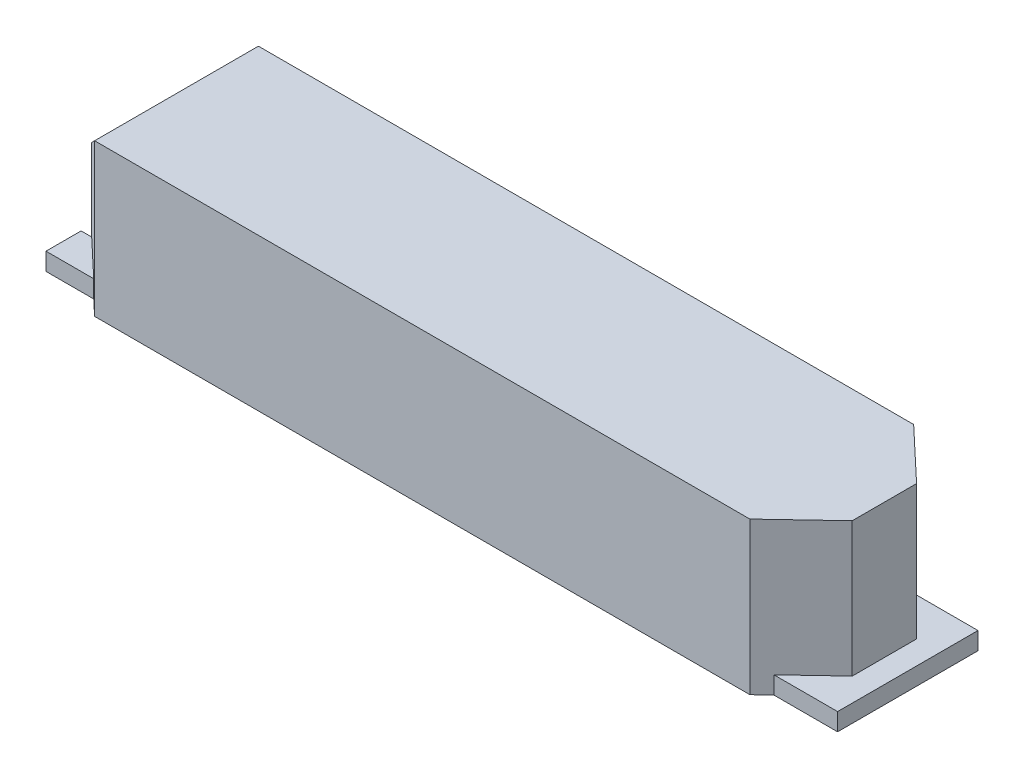
ISO-10303-21;
HEADER;
FILE_DESCRIPTION(('STEP AP214'),'2;1');
FILE_NAME('part.step','',(''),(''),'','','');
FILE_SCHEMA(('AUTOMOTIVE_DESIGN { 1 0 10303 214 1 1 1 1 }'));
ENDSEC;
DATA;
#1=APPLICATION_CONTEXT('core data for automotive mechanical design processes');
#2=APPLICATION_PROTOCOL_DEFINITION('international standard','automotive_design',2000,#1);
#3=PRODUCT_CONTEXT('',#1,'mechanical');
#4=PRODUCT('Part','Part','',(#3));
#5=PRODUCT_RELATED_PRODUCT_CATEGORY('part','',(#4));
#6=PRODUCT_DEFINITION_FORMATION('','',#4);
#7=PRODUCT_DEFINITION_CONTEXT('part definition',#1,'design');
#8=PRODUCT_DEFINITION('design','',#6,#7);
#9=PRODUCT_DEFINITION_SHAPE('','',#8);
#10=(LENGTH_UNIT() NAMED_UNIT(*) SI_UNIT(.MILLI.,.METRE.));
#11=(NAMED_UNIT(*) PLANE_ANGLE_UNIT() SI_UNIT($,.RADIAN.));
#12=(NAMED_UNIT(*) SI_UNIT($,.STERADIAN.) SOLID_ANGLE_UNIT());
#13=UNCERTAINTY_MEASURE_WITH_UNIT(LENGTH_MEASURE(1.E-05),#10,'distance_accuracy_value','');
#14=(GEOMETRIC_REPRESENTATION_CONTEXT(3) GLOBAL_UNCERTAINTY_ASSIGNED_CONTEXT((#13)) GLOBAL_UNIT_ASSIGNED_CONTEXT((#10,
#11,#12)) REPRESENTATION_CONTEXT('',''));
#15=CARTESIAN_POINT('',(0.,0.,0.));
#16=DIRECTION('',(0.,0.,1.));
#17=DIRECTION('',(1.,0.,0.));
#18=AXIS2_PLACEMENT_3D('',#15,#16,#17);
#19=CARTESIAN_POINT('',(3.25,1.3,-0.275));
#20=DIRECTION('',(-1.,0.,0.));
#21=DIRECTION('',(0.,0.,1.));
#22=AXIS2_PLACEMENT_3D('',#19,#20,#21);
#23=PLANE('',#22);
#24=DIRECTION('',(0.,0.,1.));
#25=VECTOR('',#24,1.);
#26=CARTESIAN_POINT('',(3.25,0.15,-0.275));
#27=LINE('',#26,#25);
#28=CARTESIAN_POINT('',(3.25,0.15,-0.275));
#29=VERTEX_POINT('',#28);
#30=CARTESIAN_POINT('',(3.25,0.15,0.275));
#31=VERTEX_POINT('',#30);
#32=EDGE_CURVE('E41',#29,#31,#27,.T.);
#33=ORIENTED_EDGE('',*,*,#32,.F.);
#34=DIRECTION('',(0.,-1.,0.));
#35=VECTOR('',#34,1.);
#36=CARTESIAN_POINT('',(3.25,1.3,-0.275));
#37=LINE('',#36,#35);
#38=CARTESIAN_POINT('',(3.25,1.3,-0.275));
#39=VERTEX_POINT('',#38);
#40=EDGE_CURVE('E279',#39,#29,#37,.T.);
#41=ORIENTED_EDGE('',*,*,#40,.F.);
#42=DIRECTION('',(0.,0.,-1.));
#43=VECTOR('',#42,1.);
#44=CARTESIAN_POINT('',(3.25,1.3,-0.275));
#45=LINE('',#44,#43);
#46=CARTESIAN_POINT('',(3.25,1.3,0.275));
#47=VERTEX_POINT('',#46);
#48=EDGE_CURVE('E277',#47,#39,#45,.T.);
#49=ORIENTED_EDGE('',*,*,#48,.F.);
#50=DIRECTION('',(0.,-1.,0.));
#51=VECTOR('',#50,1.);
#52=CARTESIAN_POINT('',(3.25,1.3,0.275));
#53=LINE('',#52,#51);
#54=EDGE_CURVE('E294',#47,#31,#53,.T.);
#55=ORIENTED_EDGE('',*,*,#54,.T.);
#56=EDGE_LOOP('',(#33,#41,#49,#55));
#57=FACE_BOUND('',#56,.T.);
#58=ADVANCED_FACE('F33',(#57),#23,.F.);
#59=CARTESIAN_POINT('',(3.25,1.3,-0.275));
#60=DIRECTION('',(-0.686623532963717,0.,0.727013152549817));
#61=DIRECTION('',(0.727013152549817,0.,0.686623532963717));
#62=AXIS2_PLACEMENT_3D('',#59,#60,#61);
#63=PLANE('',#62);
#64=DIRECTION('',(0.727013152549817,0.,0.686623532963717));
#65=VECTOR('',#64,1.);
#66=CARTESIAN_POINT('',(3.25,0.15,-0.275));
#67=LINE('',#66,#65);
#68=CARTESIAN_POINT('',(2.90588235294118,0.15,-0.6));
#69=VERTEX_POINT('',#68);
#70=EDGE_CURVE('E48',#69,#29,#67,.T.);
#71=ORIENTED_EDGE('',*,*,#70,.F.);
#72=DIRECTION('',(0.,-1.,0.));
#73=VECTOR('',#72,1.);
#74=CARTESIAN_POINT('',(2.90588235294118,1.3,-0.6));
#75=LINE('',#74,#73);
#76=CARTESIAN_POINT('',(2.90588235294118,0.,-0.6));
#77=VERTEX_POINT('',#76);
#78=EDGE_CURVE('E220',#69,#77,#75,.T.);
#79=ORIENTED_EDGE('',*,*,#78,.T.);
#80=DIRECTION('',(-0.727013152549817,0.,-0.686623532963717));
#81=VECTOR('',#80,1.);
#82=CARTESIAN_POINT('',(3.25,0.,-0.275));
#83=LINE('',#82,#81);
#84=CARTESIAN_POINT('',(2.8,0.,-0.700000000000001));
#85=VERTEX_POINT('',#84);
#86=EDGE_CURVE('E265',#77,#85,#83,.T.);
#87=ORIENTED_EDGE('',*,*,#86,.T.);
#88=DIRECTION('',(0.,-1.,0.));
#89=VECTOR('',#88,1.);
#90=CARTESIAN_POINT('',(2.8,1.3,-0.700000000000001));
#91=LINE('',#90,#89);
#92=CARTESIAN_POINT('',(2.8,1.3,-0.700000000000001));
#93=VERTEX_POINT('',#92);
#94=EDGE_CURVE('E312',#93,#85,#91,.T.);
#95=ORIENTED_EDGE('',*,*,#94,.F.);
#96=DIRECTION('',(-0.727013152549817,0.,-0.686623532963717));
#97=VECTOR('',#96,1.);
#98=CARTESIAN_POINT('',(3.25,1.3,-0.275));
#99=LINE('',#98,#97);
#100=EDGE_CURVE('E266',#39,#93,#99,.T.);
#101=ORIENTED_EDGE('',*,*,#100,.F.);
#102=ORIENTED_EDGE('',*,*,#40,.T.);
#103=EDGE_LOOP('',(#71,#79,#87,#95,#101,#102));
#104=FACE_BOUND('',#103,.T.);
#105=ADVANCED_FACE('F35',(#104),#63,.F.);
#106=CARTESIAN_POINT('',(2.8,1.3,-0.700000000000001));
#107=DIRECTION('',(0.,0.,1.));
#108=DIRECTION('',(1.,0.,0.));
#109=AXIS2_PLACEMENT_3D('',#106,#107,#108);
#110=PLANE('',#109);
#111=DIRECTION('',(-1.,0.,0.));
#112=VECTOR('',#111,1.);
#113=CARTESIAN_POINT('',(2.8,0.,-0.700000000000001));
#114=LINE('',#113,#112);
#115=CARTESIAN_POINT('',(-2.8,0.,-0.700000000000001));
#116=VERTEX_POINT('',#115);
#117=EDGE_CURVE('E281',#85,#116,#114,.T.);
#118=ORIENTED_EDGE('',*,*,#117,.T.);
#119=DIRECTION('',(0.,-1.,0.));
#120=VECTOR('',#119,1.);
#121=CARTESIAN_POINT('',(-2.8,1.3,-0.700000000000001));
#122=LINE('',#121,#120);
#123=CARTESIAN_POINT('',(-2.8,1.3,-0.700000000000001));
#124=VERTEX_POINT('',#123);
#125=EDGE_CURVE('E309',#124,#116,#122,.T.);
#126=ORIENTED_EDGE('',*,*,#125,.F.);
#127=DIRECTION('',(-1.,0.,0.));
#128=VECTOR('',#127,1.);
#129=CARTESIAN_POINT('',(2.8,1.3,-0.700000000000001));
#130=LINE('',#129,#128);
#131=EDGE_CURVE('E269',#93,#124,#130,.T.);
#132=ORIENTED_EDGE('',*,*,#131,.F.);
#133=ORIENTED_EDGE('',*,*,#94,.T.);
#134=EDGE_LOOP('',(#118,#126,#132,#133));
#135=FACE_BOUND('',#134,.T.);
#136=ADVANCED_FACE('F353',(#135),#110,.F.);
#137=CARTESIAN_POINT('',(-3.25,1.3,-0.275));
#138=DIRECTION('',(0.686623532963717,0.,0.727013152549817));
#139=DIRECTION('',(0.727013152549817,0.,-0.686623532963717));
#140=AXIS2_PLACEMENT_3D('',#137,#138,#139);
#141=PLANE('',#140);
#142=DIRECTION('',(-0.727013152549817,0.,0.686623532963717));
#143=VECTOR('',#142,1.);
#144=CARTESIAN_POINT('',(-3.25,0.,-0.275));
#145=LINE('',#144,#143);
#146=CARTESIAN_POINT('',(-2.93235294117647,0.,-0.575));
#147=VERTEX_POINT('',#146);
#148=EDGE_CURVE('E283',#116,#147,#145,.T.);
#149=ORIENTED_EDGE('',*,*,#148,.T.);
#150=DIRECTION('',(0.,1.,0.));
#151=VECTOR('',#150,1.);
#152=CARTESIAN_POINT('',(-2.93235294117647,1.3,-0.575));
#153=LINE('',#152,#151);
#154=CARTESIAN_POINT('',(-2.93235294117647,0.15,-0.575));
#155=VERTEX_POINT('',#154);
#156=EDGE_CURVE('E196',#147,#155,#153,.T.);
#157=ORIENTED_EDGE('',*,*,#156,.T.);
#158=DIRECTION('',(-0.727013152549817,0.,0.686623532963717));
#159=VECTOR('',#158,1.);
#160=CARTESIAN_POINT('',(-3.25,0.15,-0.275));
#161=LINE('',#160,#159);
#162=CARTESIAN_POINT('',(-3.25,0.15,-0.275));
#163=VERTEX_POINT('',#162);
#164=EDGE_CURVE('E11',#155,#163,#161,.T.);
#165=ORIENTED_EDGE('',*,*,#164,.T.);
#166=DIRECTION('',(0.,-1.,0.));
#167=VECTOR('',#166,1.);
#168=CARTESIAN_POINT('',(-3.25,1.3,-0.275));
#169=LINE('',#168,#167);
#170=CARTESIAN_POINT('',(-3.25,0.85,-0.275));
#171=VERTEX_POINT('',#170);
#172=EDGE_CURVE('E306',#171,#163,#169,.T.);
#173=ORIENTED_EDGE('',*,*,#172,.F.);
#174=DIRECTION('',(0.588034368346321,0.588034368346321,-0.555365792327082));
#175=VECTOR('',#174,1.);
#176=CARTESIAN_POINT('',(-3.09439701173959,1.00560298826041,-0.421958377801494));
#177=LINE('',#176,#175);
#178=EDGE_CURVE('E262',#171,#124,#177,.T.);
#179=ORIENTED_EDGE('',*,*,#178,.T.);
#180=ORIENTED_EDGE('',*,*,#125,.T.);
#181=EDGE_LOOP('',(#149,#157,#165,#173,#179,#180));
#182=FACE_BOUND('',#181,.T.);
#183=ADVANCED_FACE('F497',(#182),#141,.F.);
#184=CARTESIAN_POINT('',(-3.25,1.3,-0.275));
#185=DIRECTION('',(1.,0.,0.));
#186=DIRECTION('',(0.,0.,-1.));
#187=AXIS2_PLACEMENT_3D('',#184,#185,#186);
#188=PLANE('',#187);
#189=DIRECTION('',(0.,-1.,0.));
#190=VECTOR('',#189,1.);
#191=CARTESIAN_POINT('',(-3.25,1.3,0.275));
#192=LINE('',#191,#190);
#193=CARTESIAN_POINT('',(-3.25,0.85,0.275000000000001));
#194=VERTEX_POINT('',#193);
#195=CARTESIAN_POINT('',(-3.25,0.15,0.275));
#196=VERTEX_POINT('',#195);
#197=EDGE_CURVE('E303',#194,#196,#192,.T.);
#198=ORIENTED_EDGE('',*,*,#197,.F.);
#199=DIRECTION('',(0.,0.,1.));
#200=VECTOR('',#199,1.);
#201=CARTESIAN_POINT('',(-3.25,0.85,-0.700000000000001));
#202=LINE('',#201,#200);
#203=EDGE_CURVE('E254',#171,#194,#202,.T.);
#204=ORIENTED_EDGE('',*,*,#203,.F.);
#205=ORIENTED_EDGE('',*,*,#172,.T.);
#206=DIRECTION('',(0.,-1.,0.));
#207=VECTOR('',#206,1.);
#208=CARTESIAN_POINT('',(-3.25,1.3,-0.275));
#209=LINE('',#208,#207);
#210=CARTESIAN_POINT('',(-3.25,0.,-0.275));
#211=VERTEX_POINT('',#210);
#212=EDGE_CURVE('E171',#163,#211,#209,.T.);
#213=ORIENTED_EDGE('',*,*,#212,.T.);
#214=DIRECTION('',(0.,0.,1.));
#215=VECTOR('',#214,1.);
#216=CARTESIAN_POINT('',(-3.25,0.,-0.275));
#217=LINE('',#216,#215);
#218=CARTESIAN_POINT('',(-3.25,0.,0.275));
#219=VERTEX_POINT('',#218);
#220=EDGE_CURVE('E286',#211,#219,#217,.T.);
#221=ORIENTED_EDGE('',*,*,#220,.T.);
#222=DIRECTION('',(0.,1.,0.));
#223=VECTOR('',#222,1.);
#224=CARTESIAN_POINT('',(-3.25,1.3,0.275));
#225=LINE('',#224,#223);
#226=EDGE_CURVE('E252',#219,#196,#225,.T.);
#227=ORIENTED_EDGE('',*,*,#226,.T.);
#228=EDGE_LOOP('',(#198,#204,#205,#213,#221,#227));
#229=FACE_BOUND('',#228,.T.);
#230=ADVANCED_FACE('F487',(#229),#188,.F.);
#231=CARTESIAN_POINT('',(-3.25,1.3,0.275));
#232=DIRECTION('',(0.686623532963717,0.,-0.727013152549817));
#233=DIRECTION('',(-0.727013152549817,0.,-0.686623532963717));
#234=AXIS2_PLACEMENT_3D('',#231,#232,#233);
#235=PLANE('',#234);
#236=DIRECTION('',(-0.727013152549817,0.,-0.686623532963717));
#237=VECTOR('',#236,1.);
#238=CARTESIAN_POINT('',(-3.25,0.15,0.275));
#239=LINE('',#238,#237);
#240=CARTESIAN_POINT('',(-2.93235294117647,0.15,0.575));
#241=VERTEX_POINT('',#240);
#242=EDGE_CURVE('E315',#241,#196,#239,.T.);
#243=ORIENTED_EDGE('',*,*,#242,.F.);
#244=DIRECTION('',(0.,-1.,0.));
#245=VECTOR('',#244,1.);
#246=CARTESIAN_POINT('',(-2.93235294117647,1.3,0.575));
#247=LINE('',#246,#245);
#248=CARTESIAN_POINT('',(-2.93235294117647,0.,0.575));
#249=VERTEX_POINT('',#248);
#250=EDGE_CURVE('E247',#241,#249,#247,.T.);
#251=ORIENTED_EDGE('',*,*,#250,.T.);
#252=DIRECTION('',(0.727013152549817,0.,0.686623532963717));
#253=VECTOR('',#252,1.);
#254=CARTESIAN_POINT('',(-3.25,0.,0.275));
#255=LINE('',#254,#253);
#256=CARTESIAN_POINT('',(-2.8,0.,0.700000000000001));
#257=VERTEX_POINT('',#256);
#258=EDGE_CURVE('E288',#249,#257,#255,.T.);
#259=ORIENTED_EDGE('',*,*,#258,.T.);
#260=DIRECTION('',(0.,-1.,0.));
#261=VECTOR('',#260,1.);
#262=CARTESIAN_POINT('',(-2.8,1.3,0.700000000000001));
#263=LINE('',#262,#261);
#264=CARTESIAN_POINT('',(-2.8,1.3,0.700000000000001));
#265=VERTEX_POINT('',#264);
#266=EDGE_CURVE('E300',#265,#257,#263,.T.);
#267=ORIENTED_EDGE('',*,*,#266,.F.);
#268=DIRECTION('',(-0.588034368346321,-0.588034368346321,-0.555365792327082));
#269=VECTOR('',#268,1.);
#270=CARTESIAN_POINT('',(-3.09439701173959,1.00560298826041,0.421958377801494));
#271=LINE('',#270,#269);
#272=EDGE_CURVE('E258',#265,#194,#271,.T.);
#273=ORIENTED_EDGE('',*,*,#272,.T.);
#274=ORIENTED_EDGE('',*,*,#197,.T.);
#275=EDGE_LOOP('',(#243,#251,#259,#267,#273,#274));
#276=FACE_BOUND('',#275,.T.);
#277=ADVANCED_FACE('F345',(#276),#235,.F.);
#278=CARTESIAN_POINT('',(2.8,1.3,0.700000000000001));
#279=DIRECTION('',(0.,0.,-1.));
#280=DIRECTION('',(-1.,0.,0.));
#281=AXIS2_PLACEMENT_3D('',#278,#279,#280);
#282=PLANE('',#281);
#283=DIRECTION('',(1.,0.,0.));
#284=VECTOR('',#283,1.);
#285=CARTESIAN_POINT('',(2.8,0.,0.700000000000001));
#286=LINE('',#285,#284);
#287=CARTESIAN_POINT('',(2.8,0.,0.700000000000001));
#288=VERTEX_POINT('',#287);
#289=EDGE_CURVE('E290',#257,#288,#286,.T.);
#290=ORIENTED_EDGE('',*,*,#289,.T.);
#291=DIRECTION('',(0.,-1.,0.));
#292=VECTOR('',#291,1.);
#293=CARTESIAN_POINT('',(2.8,1.3,0.700000000000001));
#294=LINE('',#293,#292);
#295=CARTESIAN_POINT('',(2.8,1.3,0.700000000000001));
#296=VERTEX_POINT('',#295);
#297=EDGE_CURVE('E297',#296,#288,#294,.T.);
#298=ORIENTED_EDGE('',*,*,#297,.F.);
#299=DIRECTION('',(1.,0.,0.));
#300=VECTOR('',#299,1.);
#301=CARTESIAN_POINT('',(2.8,1.3,0.700000000000001));
#302=LINE('',#301,#300);
#303=EDGE_CURVE('E273',#265,#296,#302,.T.);
#304=ORIENTED_EDGE('',*,*,#303,.F.);
#305=ORIENTED_EDGE('',*,*,#266,.T.);
#306=EDGE_LOOP('',(#290,#298,#304,#305));
#307=FACE_BOUND('',#306,.T.);
#308=ADVANCED_FACE('F337',(#307),#282,.F.);
#309=CARTESIAN_POINT('',(3.25,1.3,0.275));
#310=DIRECTION('',(-0.686623532963717,0.,-0.727013152549817));
#311=DIRECTION('',(-0.727013152549817,0.,0.686623532963717));
#312=AXIS2_PLACEMENT_3D('',#309,#310,#311);
#313=PLANE('',#312);
#314=DIRECTION('',(0.727013152549817,0.,-0.686623532963717));
#315=VECTOR('',#314,1.);
#316=CARTESIAN_POINT('',(3.25,0.,0.275));
#317=LINE('',#316,#315);
#318=CARTESIAN_POINT('',(2.90588235294118,0.,0.6));
#319=VERTEX_POINT('',#318);
#320=EDGE_CURVE('E270',#288,#319,#317,.T.);
#321=ORIENTED_EDGE('',*,*,#320,.T.);
#322=DIRECTION('',(0.,1.,0.));
#323=VECTOR('',#322,1.);
#324=CARTESIAN_POINT('',(2.90588235294118,1.3,0.6));
#325=LINE('',#324,#323);
#326=CARTESIAN_POINT('',(2.90588235294118,0.15,0.6));
#327=VERTEX_POINT('',#326);
#328=EDGE_CURVE('E56',#319,#327,#325,.T.);
#329=ORIENTED_EDGE('',*,*,#328,.T.);
#330=DIRECTION('',(-0.727013152549817,0.,0.686623532963717));
#331=VECTOR('',#330,1.);
#332=CARTESIAN_POINT('',(3.25,0.15,0.275));
#333=LINE('',#332,#331);
#334=EDGE_CURVE('E225',#31,#327,#333,.T.);
#335=ORIENTED_EDGE('',*,*,#334,.F.);
#336=ORIENTED_EDGE('',*,*,#54,.F.);
#337=DIRECTION('',(0.727013152549817,0.,-0.686623532963717));
#338=VECTOR('',#337,1.);
#339=CARTESIAN_POINT('',(3.25,1.3,0.275));
#340=LINE('',#339,#338);
#341=EDGE_CURVE('E275',#296,#47,#340,.T.);
#342=ORIENTED_EDGE('',*,*,#341,.F.);
#343=ORIENTED_EDGE('',*,*,#297,.T.);
#344=EDGE_LOOP('',(#321,#329,#335,#336,#342,#343));
#345=FACE_BOUND('',#344,.T.);
#346=ADVANCED_FACE('F334',(#345),#313,.F.);
#347=CARTESIAN_POINT('',(0.,1.3,0.));
#348=DIRECTION('',(0.,-1.,0.));
#349=DIRECTION('',(0.,0.,-1.));
#350=AXIS2_PLACEMENT_3D('',#347,#348,#349);
#351=PLANE('',#350);
#352=ORIENTED_EDGE('',*,*,#131,.T.);
#353=DIRECTION('',(0.,0.,1.));
#354=VECTOR('',#353,1.);
#355=CARTESIAN_POINT('',(-2.8,1.3,-0.700000000000001));
#356=LINE('',#355,#354);
#357=EDGE_CURVE('E255',#124,#265,#356,.T.);
#358=ORIENTED_EDGE('',*,*,#357,.T.);
#359=ORIENTED_EDGE('',*,*,#303,.T.);
#360=ORIENTED_EDGE('',*,*,#341,.T.);
#361=ORIENTED_EDGE('',*,*,#48,.T.);
#362=ORIENTED_EDGE('',*,*,#100,.T.);
#363=EDGE_LOOP('',(#352,#358,#359,#360,#361,#362));
#364=FACE_BOUND('',#363,.T.);
#365=ADVANCED_FACE('F329',(#364),#351,.F.);
#366=CARTESIAN_POINT('',(0.,0.,0.));
#367=DIRECTION('',(0.,-1.,0.));
#368=DIRECTION('',(0.,0.,-1.));
#369=AXIS2_PLACEMENT_3D('',#366,#367,#368);
#370=PLANE('',#369);
#371=ORIENTED_EDGE('',*,*,#220,.F.);
#372=DIRECTION('',(-1.,0.,0.));
#373=VECTOR('',#372,1.);
#374=CARTESIAN_POINT('',(-3.34033915199299,0.,-0.275));
#375=LINE('',#374,#373);
#376=CARTESIAN_POINT('',(-3.34033915199299,0.,-0.275));
#377=VERTEX_POINT('',#376);
#378=EDGE_CURVE('E191',#211,#377,#375,.T.);
#379=ORIENTED_EDGE('',*,*,#378,.T.);
#380=DIRECTION('',(0.,0.,-1.));
#381=VECTOR('',#380,1.);
#382=CARTESIAN_POINT('',(-3.34033915199299,0.,-0.275));
#383=LINE('',#382,#381);
#384=CARTESIAN_POINT('',(-3.34033915199299,0.,-0.575));
#385=VERTEX_POINT('',#384);
#386=EDGE_CURVE('E181',#377,#385,#383,.T.);
#387=ORIENTED_EDGE('',*,*,#386,.T.);
#388=DIRECTION('',(1.,0.,0.));
#389=VECTOR('',#388,1.);
#390=CARTESIAN_POINT('',(-3.34033915199299,0.,-0.575));
#391=LINE('',#390,#389);
#392=EDGE_CURVE('E175',#385,#147,#391,.T.);
#393=ORIENTED_EDGE('',*,*,#392,.T.);
#394=ORIENTED_EDGE('',*,*,#148,.F.);
#395=ORIENTED_EDGE('',*,*,#117,.F.);
#396=ORIENTED_EDGE('',*,*,#86,.F.);
#397=DIRECTION('',(1.,0.,0.));
#398=VECTOR('',#397,1.);
#399=CARTESIAN_POINT('',(3.45,0.,-0.6));
#400=LINE('',#399,#398);
#401=CARTESIAN_POINT('',(3.45,0.,-0.6));
#402=VERTEX_POINT('',#401);
#403=EDGE_CURVE('E214',#77,#402,#400,.T.);
#404=ORIENTED_EDGE('',*,*,#403,.T.);
#405=DIRECTION('',(0.,0.,1.));
#406=VECTOR('',#405,1.);
#407=CARTESIAN_POINT('',(3.45,0.,-0.6));
#408=LINE('',#407,#406);
#409=CARTESIAN_POINT('',(3.45,0.,0.6));
#410=VERTEX_POINT('',#409);
#411=EDGE_CURVE('E206',#402,#410,#408,.T.);
#412=ORIENTED_EDGE('',*,*,#411,.T.);
#413=DIRECTION('',(-1.,0.,0.));
#414=VECTOR('',#413,1.);
#415=CARTESIAN_POINT('',(3.45,0.,0.6));
#416=LINE('',#415,#414);
#417=EDGE_CURVE('E201',#410,#319,#416,.T.);
#418=ORIENTED_EDGE('',*,*,#417,.T.);
#419=ORIENTED_EDGE('',*,*,#320,.F.);
#420=ORIENTED_EDGE('',*,*,#289,.F.);
#421=ORIENTED_EDGE('',*,*,#258,.F.);
#422=DIRECTION('',(-1.,0.,0.));
#423=VECTOR('',#422,1.);
#424=CARTESIAN_POINT('',(-3.34033915199299,0.,0.575));
#425=LINE('',#424,#423);
#426=CARTESIAN_POINT('',(-3.34033915199299,0.,0.575));
#427=VERTEX_POINT('',#426);
#428=EDGE_CURVE('E241',#249,#427,#425,.T.);
#429=ORIENTED_EDGE('',*,*,#428,.T.);
#430=DIRECTION('',(0.,0.,-1.));
#431=VECTOR('',#430,1.);
#432=CARTESIAN_POINT('',(-3.34033915199299,0.,0.275));
#433=LINE('',#432,#431);
#434=CARTESIAN_POINT('',(-3.34033915199299,0.,0.275));
#435=VERTEX_POINT('',#434);
#436=EDGE_CURVE('E233',#427,#435,#433,.T.);
#437=ORIENTED_EDGE('',*,*,#436,.T.);
#438=DIRECTION('',(1.,0.,0.));
#439=VECTOR('',#438,1.);
#440=CARTESIAN_POINT('',(-3.34033915199299,0.,0.275));
#441=LINE('',#440,#439);
#442=EDGE_CURVE('E228',#435,#219,#441,.T.);
#443=ORIENTED_EDGE('',*,*,#442,.T.);
#444=EDGE_LOOP('',(#371,#379,#387,#393,#394,#395,#396,#404,#412,#418,#419,#420,#421,#429,#437,#443));
#445=FACE_BOUND('',#444,.T.);
#446=ADVANCED_FACE('F343',(#445),#370,.T.);
#447=CARTESIAN_POINT('',(-2.8,1.3,-0.700000000000001));
#448=DIRECTION('',(0.707106781186548,-0.707106781186547,0.));
#449=DIRECTION('',(0.707106781186547,0.707106781186548,0.));
#450=AXIS2_PLACEMENT_3D('',#447,#448,#449);
#451=PLANE('',#450);
#452=ORIENTED_EDGE('',*,*,#203,.T.);
#453=ORIENTED_EDGE('',*,*,#272,.F.);
#454=ORIENTED_EDGE('',*,*,#357,.F.);
#455=ORIENTED_EDGE('',*,*,#178,.F.);
#456=EDGE_LOOP('',(#452,#453,#454,#455));
#457=FACE_BOUND('',#456,.T.);
#458=ADVANCED_FACE('F356',(#457),#451,.F.);
#459=CARTESIAN_POINT('',(0.,0.15,0.));
#460=DIRECTION('',(0.,-1.,0.));
#461=DIRECTION('',(0.,0.,-1.));
#462=AXIS2_PLACEMENT_3D('',#459,#460,#461);
#463=PLANE('',#462);
#464=DIRECTION('',(-1.,0.,0.));
#465=VECTOR('',#464,1.);
#466=CARTESIAN_POINT('',(-3.34033915199299,0.15,0.575));
#467=LINE('',#466,#465);
#468=CARTESIAN_POINT('',(-3.34033915199299,0.15,0.575));
#469=VERTEX_POINT('',#468);
#470=EDGE_CURVE('E232',#241,#469,#467,.T.);
#471=ORIENTED_EDGE('',*,*,#470,.F.);
#472=ORIENTED_EDGE('',*,*,#242,.T.);
#473=DIRECTION('',(1.,0.,0.));
#474=VECTOR('',#473,1.);
#475=CARTESIAN_POINT('',(-3.34033915199299,0.15,0.275));
#476=LINE('',#475,#474);
#477=CARTESIAN_POINT('',(-3.34033915199299,0.15,0.275));
#478=VERTEX_POINT('',#477);
#479=EDGE_CURVE('E229',#478,#196,#476,.T.);
#480=ORIENTED_EDGE('',*,*,#479,.F.);
#481=DIRECTION('',(0.,0.,-1.));
#482=VECTOR('',#481,1.);
#483=CARTESIAN_POINT('',(-3.34033915199299,0.15,0.275));
#484=LINE('',#483,#482);
#485=EDGE_CURVE('E235',#469,#478,#484,.T.);
#486=ORIENTED_EDGE('',*,*,#485,.F.);
#487=EDGE_LOOP('',(#471,#472,#480,#486));
#488=FACE_BOUND('',#487,.T.);
#489=ADVANCED_FACE('F361',(#488),#463,.F.);
#490=CARTESIAN_POINT('',(-3.34033915199299,0.15,0.275));
#491=DIRECTION('',(0.,0.,-1.));
#492=DIRECTION('',(-1.,0.,0.));
#493=AXIS2_PLACEMENT_3D('',#490,#491,#492);
#494=PLANE('',#493);
#495=ORIENTED_EDGE('',*,*,#226,.F.);
#496=ORIENTED_EDGE('',*,*,#442,.F.);
#497=DIRECTION('',(0.,-1.,0.));
#498=VECTOR('',#497,1.);
#499=CARTESIAN_POINT('',(-3.34033915199299,0.15,0.275));
#500=LINE('',#499,#498);
#501=EDGE_CURVE('E245',#478,#435,#500,.T.);
#502=ORIENTED_EDGE('',*,*,#501,.F.);
#503=ORIENTED_EDGE('',*,*,#479,.T.);
#504=EDGE_LOOP('',(#495,#496,#502,#503));
#505=FACE_BOUND('',#504,.T.);
#506=ADVANCED_FACE('F363',(#505),#494,.T.);
#507=CARTESIAN_POINT('',(-3.34033915199299,0.15,0.575));
#508=DIRECTION('',(0.,0.,1.));
#509=DIRECTION('',(1.,0.,0.));
#510=AXIS2_PLACEMENT_3D('',#507,#508,#509);
#511=PLANE('',#510);
#512=ORIENTED_EDGE('',*,*,#250,.F.);
#513=ORIENTED_EDGE('',*,*,#470,.T.);
#514=DIRECTION('',(0.,-1.,0.));
#515=VECTOR('',#514,1.);
#516=CARTESIAN_POINT('',(-3.34033915199299,0.15,0.575));
#517=LINE('',#516,#515);
#518=EDGE_CURVE('E238',#469,#427,#517,.T.);
#519=ORIENTED_EDGE('',*,*,#518,.T.);
#520=ORIENTED_EDGE('',*,*,#428,.F.);
#521=EDGE_LOOP('',(#512,#513,#519,#520));
#522=FACE_BOUND('',#521,.T.);
#523=ADVANCED_FACE('F366',(#522),#511,.T.);
#524=CARTESIAN_POINT('',(-3.34033915199299,0.15,0.275));
#525=DIRECTION('',(-1.,0.,0.));
#526=DIRECTION('',(0.,0.,1.));
#527=AXIS2_PLACEMENT_3D('',#524,#525,#526);
#528=PLANE('',#527);
#529=ORIENTED_EDGE('',*,*,#436,.F.);
#530=ORIENTED_EDGE('',*,*,#518,.F.);
#531=ORIENTED_EDGE('',*,*,#485,.T.);
#532=ORIENTED_EDGE('',*,*,#501,.T.);
#533=EDGE_LOOP('',(#529,#530,#531,#532));
#534=FACE_BOUND('',#533,.T.);
#535=ADVANCED_FACE('F370',(#534),#528,.T.);
#536=CARTESIAN_POINT('',(0.,0.15,0.));
#537=DIRECTION('',(0.,-1.,0.));
#538=DIRECTION('',(0.,0.,-1.));
#539=AXIS2_PLACEMENT_3D('',#536,#537,#538);
#540=PLANE('',#539);
#541=DIRECTION('',(1.,0.,0.));
#542=VECTOR('',#541,1.);
#543=CARTESIAN_POINT('',(3.45,0.15,-0.6));
#544=LINE('',#543,#542);
#545=CARTESIAN_POINT('',(3.45,0.15,-0.6));
#546=VERTEX_POINT('',#545);
#547=EDGE_CURVE('E205',#69,#546,#544,.T.);
#548=ORIENTED_EDGE('',*,*,#547,.F.);
#549=ORIENTED_EDGE('',*,*,#70,.T.);
#550=ORIENTED_EDGE('',*,*,#32,.T.);
#551=ORIENTED_EDGE('',*,*,#334,.T.);
#552=DIRECTION('',(-1.,0.,0.));
#553=VECTOR('',#552,1.);
#554=CARTESIAN_POINT('',(3.45,0.15,0.6));
#555=LINE('',#554,#553);
#556=CARTESIAN_POINT('',(3.45,0.15,0.6));
#557=VERTEX_POINT('',#556);
#558=EDGE_CURVE('E202',#557,#327,#555,.T.);
#559=ORIENTED_EDGE('',*,*,#558,.F.);
#560=DIRECTION('',(0.,0.,1.));
#561=VECTOR('',#560,1.);
#562=CARTESIAN_POINT('',(3.45,0.15,-0.6));
#563=LINE('',#562,#561);
#564=EDGE_CURVE('E208',#546,#557,#563,.T.);
#565=ORIENTED_EDGE('',*,*,#564,.F.);
#566=EDGE_LOOP('',(#548,#549,#550,#551,#559,#565));
#567=FACE_BOUND('',#566,.T.);
#568=ADVANCED_FACE('F320',(#567),#540,.F.);
#569=CARTESIAN_POINT('',(3.45,0.15,0.6));
#570=DIRECTION('',(0.,0.,1.));
#571=DIRECTION('',(1.,0.,0.));
#572=AXIS2_PLACEMENT_3D('',#569,#570,#571);
#573=PLANE('',#572);
#574=ORIENTED_EDGE('',*,*,#328,.F.);
#575=ORIENTED_EDGE('',*,*,#417,.F.);
#576=DIRECTION('',(0.,-1.,0.));
#577=VECTOR('',#576,1.);
#578=CARTESIAN_POINT('',(3.45,0.15,0.6));
#579=LINE('',#578,#577);
#580=EDGE_CURVE('E218',#557,#410,#579,.T.);
#581=ORIENTED_EDGE('',*,*,#580,.F.);
#582=ORIENTED_EDGE('',*,*,#558,.T.);
#583=EDGE_LOOP('',(#574,#575,#581,#582));
#584=FACE_BOUND('',#583,.T.);
#585=ADVANCED_FACE('F378',(#584),#573,.T.);
#586=CARTESIAN_POINT('',(3.45,0.15,-0.6));
#587=DIRECTION('',(0.,0.,-1.));
#588=DIRECTION('',(-1.,0.,0.));
#589=AXIS2_PLACEMENT_3D('',#586,#587,#588);
#590=PLANE('',#589);
#591=ORIENTED_EDGE('',*,*,#78,.F.);
#592=ORIENTED_EDGE('',*,*,#547,.T.);
#593=DIRECTION('',(0.,-1.,0.));
#594=VECTOR('',#593,1.);
#595=CARTESIAN_POINT('',(3.45,0.15,-0.6));
#596=LINE('',#595,#594);
#597=EDGE_CURVE('E211',#546,#402,#596,.T.);
#598=ORIENTED_EDGE('',*,*,#597,.T.);
#599=ORIENTED_EDGE('',*,*,#403,.F.);
#600=EDGE_LOOP('',(#591,#592,#598,#599));
#601=FACE_BOUND('',#600,.T.);
#602=ADVANCED_FACE('F381',(#601),#590,.T.);
#603=CARTESIAN_POINT('',(3.45,0.15,-0.6));
#604=DIRECTION('',(1.,0.,0.));
#605=DIRECTION('',(0.,0.,-1.));
#606=AXIS2_PLACEMENT_3D('',#603,#604,#605);
#607=PLANE('',#606);
#608=ORIENTED_EDGE('',*,*,#411,.F.);
#609=ORIENTED_EDGE('',*,*,#597,.F.);
#610=ORIENTED_EDGE('',*,*,#564,.T.);
#611=ORIENTED_EDGE('',*,*,#580,.T.);
#612=EDGE_LOOP('',(#608,#609,#610,#611));
#613=FACE_BOUND('',#612,.T.);
#614=ADVANCED_FACE('F385',(#613),#607,.T.);
#615=CARTESIAN_POINT('',(0.,0.15,0.));
#616=DIRECTION('',(0.,1.,0.));
#617=DIRECTION('',(0.,0.,1.));
#618=AXIS2_PLACEMENT_3D('',#615,#616,#617);
#619=PLANE('',#618);
#620=ORIENTED_EDGE('',*,*,#164,.F.);
#621=DIRECTION('',(1.,0.,0.));
#622=VECTOR('',#621,1.);
#623=CARTESIAN_POINT('',(-3.34033915199299,0.15,-0.575));
#624=LINE('',#623,#622);
#625=CARTESIAN_POINT('',(-3.34033915199299,0.15,-0.575));
#626=VERTEX_POINT('',#625);
#627=EDGE_CURVE('E183',#626,#155,#624,.T.);
#628=ORIENTED_EDGE('',*,*,#627,.F.);
#629=DIRECTION('',(0.,0.,-1.));
#630=VECTOR('',#629,1.);
#631=CARTESIAN_POINT('',(-3.34033915199299,0.15,-0.275));
#632=LINE('',#631,#630);
#633=CARTESIAN_POINT('',(-3.34033915199299,0.15,-0.275));
#634=VERTEX_POINT('',#633);
#635=EDGE_CURVE('E174',#634,#626,#632,.T.);
#636=ORIENTED_EDGE('',*,*,#635,.F.);
#637=DIRECTION('',(-1.,0.,0.));
#638=VECTOR('',#637,1.);
#639=CARTESIAN_POINT('',(-3.34033915199299,0.15,-0.275));
#640=LINE('',#639,#638);
#641=EDGE_CURVE('E165',#163,#634,#640,.T.);
#642=ORIENTED_EDGE('',*,*,#641,.F.);
#643=EDGE_LOOP('',(#620,#628,#636,#642));
#644=FACE_BOUND('',#643,.T.);
#645=ADVANCED_FACE('F186',(#644),#619,.T.);
#646=CARTESIAN_POINT('',(-3.34033915199299,0.15,-0.275));
#647=DIRECTION('',(0.,0.,1.));
#648=DIRECTION('',(1.,0.,0.));
#649=AXIS2_PLACEMENT_3D('',#646,#647,#648);
#650=PLANE('',#649);
#651=ORIENTED_EDGE('',*,*,#212,.F.);
#652=ORIENTED_EDGE('',*,*,#641,.T.);
#653=DIRECTION('',(0.,-1.,0.));
#654=VECTOR('',#653,1.);
#655=CARTESIAN_POINT('',(-3.34033915199299,0.15,-0.275));
#656=LINE('',#655,#654);
#657=EDGE_CURVE('E168',#634,#377,#656,.T.);
#658=ORIENTED_EDGE('',*,*,#657,.T.);
#659=ORIENTED_EDGE('',*,*,#378,.F.);
#660=EDGE_LOOP('',(#651,#652,#658,#659));
#661=FACE_BOUND('',#660,.T.);
#662=ADVANCED_FACE('F167',(#661),#650,.T.);
#663=CARTESIAN_POINT('',(-3.34033915199299,0.15,-0.575));
#664=DIRECTION('',(0.,0.,-1.));
#665=DIRECTION('',(-1.,0.,0.));
#666=AXIS2_PLACEMENT_3D('',#663,#664,#665);
#667=PLANE('',#666);
#668=ORIENTED_EDGE('',*,*,#156,.F.);
#669=ORIENTED_EDGE('',*,*,#392,.F.);
#670=DIRECTION('',(0.,-1.,0.));
#671=VECTOR('',#670,1.);
#672=CARTESIAN_POINT('',(-3.34033915199299,0.15,-0.575));
#673=LINE('',#672,#671);
#674=EDGE_CURVE('E182',#626,#385,#673,.T.);
#675=ORIENTED_EDGE('',*,*,#674,.F.);
#676=ORIENTED_EDGE('',*,*,#627,.T.);
#677=EDGE_LOOP('',(#668,#669,#675,#676));
#678=FACE_BOUND('',#677,.T.);
#679=ADVANCED_FACE('F394',(#678),#667,.T.);
#680=CARTESIAN_POINT('',(-3.34033915199299,0.15,-0.275));
#681=DIRECTION('',(-1.,0.,0.));
#682=DIRECTION('',(0.,0.,1.));
#683=AXIS2_PLACEMENT_3D('',#680,#681,#682);
#684=PLANE('',#683);
#685=ORIENTED_EDGE('',*,*,#386,.F.);
#686=ORIENTED_EDGE('',*,*,#657,.F.);
#687=ORIENTED_EDGE('',*,*,#635,.T.);
#688=ORIENTED_EDGE('',*,*,#674,.T.);
#689=EDGE_LOOP('',(#685,#686,#687,#688));
#690=FACE_BOUND('',#689,.T.);
#691=ADVANCED_FACE('F179',(#690),#684,.T.);
#692=CLOSED_SHELL('',(#58,#105,#136,#183,#230,#277,#308,#346,#365,#446,#458,#489,#506,#523,#535,
#568,#585,#602,#614,#645,#662,#679,#691));
#693=MANIFOLD_SOLID_BREP('B2',#692);
#694=ADVANCED_BREP_SHAPE_REPRESENTATION('',(#18,#693),#14);
#695=SHAPE_DEFINITION_REPRESENTATION(#9,#694);
ENDSEC;
END-ISO-10303-21;
